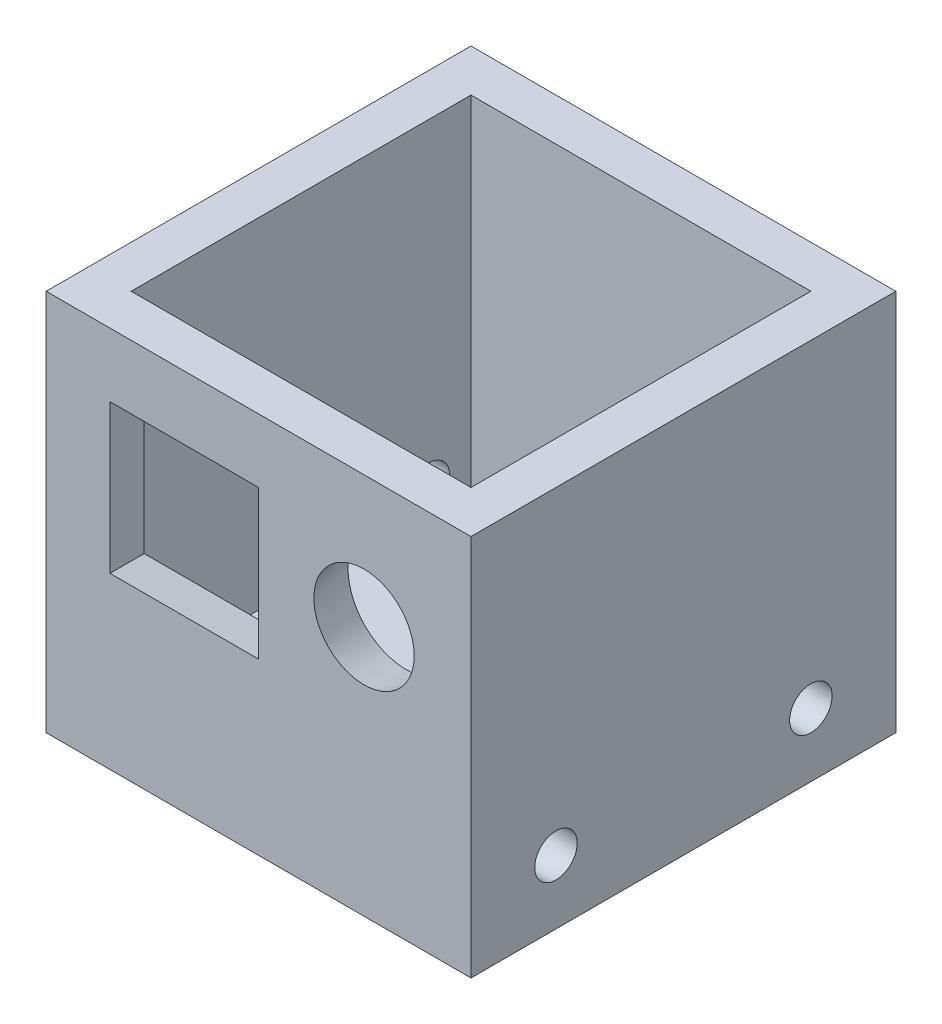
ISO-10303-21;
HEADER;
FILE_DESCRIPTION(('STEP AP214'),'2;1');
FILE_NAME('part.step','',(''),(''),'','','');
FILE_SCHEMA(('AUTOMOTIVE_DESIGN { 1 0 10303 214 1 1 1 1 }'));
ENDSEC;
DATA;
#1=APPLICATION_CONTEXT('core data for automotive mechanical design processes');
#2=APPLICATION_PROTOCOL_DEFINITION('international standard','automotive_design',2000,#1);
#3=PRODUCT_CONTEXT('',#1,'mechanical');
#4=PRODUCT('Part','Part','',(#3));
#5=PRODUCT_RELATED_PRODUCT_CATEGORY('part','',(#4));
#6=PRODUCT_DEFINITION_FORMATION('','',#4);
#7=PRODUCT_DEFINITION_CONTEXT('part definition',#1,'design');
#8=PRODUCT_DEFINITION('design','',#6,#7);
#9=PRODUCT_DEFINITION_SHAPE('','',#8);
#10=(LENGTH_UNIT() NAMED_UNIT(*) SI_UNIT(.MILLI.,.METRE.));
#11=(NAMED_UNIT(*) PLANE_ANGLE_UNIT() SI_UNIT($,.RADIAN.));
#12=(NAMED_UNIT(*) SI_UNIT($,.STERADIAN.) SOLID_ANGLE_UNIT());
#13=UNCERTAINTY_MEASURE_WITH_UNIT(LENGTH_MEASURE(1.E-05),#10,'distance_accuracy_value','');
#14=(GEOMETRIC_REPRESENTATION_CONTEXT(3) GLOBAL_UNCERTAINTY_ASSIGNED_CONTEXT((#13)) GLOBAL_UNIT_ASSIGNED_CONTEXT((#10,
#11,#12)) REPRESENTATION_CONTEXT('',''));
#15=CARTESIAN_POINT('',(0.,0.,0.));
#16=DIRECTION('',(0.,0.,1.));
#17=DIRECTION('',(1.,0.,0.));
#18=AXIS2_PLACEMENT_3D('',#15,#16,#17);
#19=CARTESIAN_POINT('',(0.,9.,0.));
#20=DIRECTION('',(1.,0.,0.));
#21=DIRECTION('',(0.,0.,-1.));
#22=AXIS2_PLACEMENT_3D('',#19,#20,#21);
#23=PLANE('',#22);
#24=CARTESIAN_POINT('',(0.,1.5,-2.));
#25=DIRECTION('',(1.,0.,0.));
#26=DIRECTION('',(0.,0.,-1.));
#27=AXIS2_PLACEMENT_3D('',#24,#25,#26);
#28=CIRCLE('',#27,0.5);
#29=CARTESIAN_POINT('',(0.,1.5,-2.5));
#30=VERTEX_POINT('',#29);
#31=EDGE_CURVE('E333',#30,#30,#28,.T.);
#32=ORIENTED_EDGE('',*,*,#31,.T.);
#33=EDGE_LOOP('',(#32));
#34=FACE_BOUND('',#33,.T.);
#35=CARTESIAN_POINT('',(0.,1.5,-8.));
#36=DIRECTION('',(1.,0.,0.));
#37=DIRECTION('',(0.,0.,-1.));
#38=AXIS2_PLACEMENT_3D('',#35,#36,#37);
#39=CIRCLE('',#38,0.500000000000001);
#40=CARTESIAN_POINT('',(0.,1.5,-8.5));
#41=VERTEX_POINT('',#40);
#42=EDGE_CURVE('E336',#41,#41,#39,.T.);
#43=ORIENTED_EDGE('',*,*,#42,.T.);
#44=EDGE_LOOP('',(#43));
#45=FACE_BOUND('',#44,.T.);
#46=DIRECTION('',(0.,0.,1.));
#47=VECTOR('',#46,1.);
#48=CARTESIAN_POINT('',(0.,0.,0.));
#49=LINE('',#48,#47);
#50=CARTESIAN_POINT('',(0.,0.,-10.));
#51=VERTEX_POINT('',#50);
#52=CARTESIAN_POINT('',(0.,0.,0.));
#53=VERTEX_POINT('',#52);
#54=EDGE_CURVE('E242',#51,#53,#49,.T.);
#55=ORIENTED_EDGE('',*,*,#54,.T.);
#56=DIRECTION('',(0.,-1.,0.));
#57=VECTOR('',#56,1.);
#58=CARTESIAN_POINT('',(0.,9.,0.));
#59=LINE('',#58,#57);
#60=CARTESIAN_POINT('',(0.,9.,0.));
#61=VERTEX_POINT('',#60);
#62=EDGE_CURVE('E49',#61,#53,#59,.T.);
#63=ORIENTED_EDGE('',*,*,#62,.F.);
#64=DIRECTION('',(0.,0.,1.));
#65=VECTOR('',#64,1.);
#66=CARTESIAN_POINT('',(0.,9.,0.));
#67=LINE('',#66,#65);
#68=CARTESIAN_POINT('',(0.,9.,-10.));
#69=VERTEX_POINT('',#68);
#70=EDGE_CURVE('E254',#69,#61,#67,.T.);
#71=ORIENTED_EDGE('',*,*,#70,.F.);
#72=DIRECTION('',(0.,-1.,0.));
#73=VECTOR('',#72,1.);
#74=CARTESIAN_POINT('',(0.,9.,-10.));
#75=LINE('',#74,#73);
#76=EDGE_CURVE('E268',#69,#51,#75,.T.);
#77=ORIENTED_EDGE('',*,*,#76,.T.);
#78=EDGE_LOOP('',(#55,#63,#71,#77));
#79=FACE_BOUND('',#78,.T.);
#80=ADVANCED_FACE('F41',(#34,#45,#79),#23,.F.);
#81=CARTESIAN_POINT('',(0.,9.,0.));
#82=DIRECTION('',(0.,0.,-1.));
#83=DIRECTION('',(-1.,0.,0.));
#84=AXIS2_PLACEMENT_3D('',#81,#82,#83);
#85=PLANE('',#84);
#86=DIRECTION('',(1.,0.,0.));
#87=VECTOR('',#86,1.);
#88=CARTESIAN_POINT('',(1.5,4.,0.));
#89=LINE('',#88,#87);
#90=CARTESIAN_POINT('',(1.5,4.,0.));
#91=VERTEX_POINT('',#90);
#92=CARTESIAN_POINT('',(5.,4.,0.));
#93=VERTEX_POINT('',#92);
#94=EDGE_CURVE('E226',#91,#93,#89,.T.);
#95=ORIENTED_EDGE('',*,*,#94,.F.);
#96=DIRECTION('',(0.,-1.,0.));
#97=VECTOR('',#96,1.);
#98=CARTESIAN_POINT('',(1.5,7.5,0.));
#99=LINE('',#98,#97);
#100=CARTESIAN_POINT('',(1.5,7.5,0.));
#101=VERTEX_POINT('',#100);
#102=EDGE_CURVE('E222',#101,#91,#99,.T.);
#103=ORIENTED_EDGE('',*,*,#102,.F.);
#104=DIRECTION('',(-1.,0.,0.));
#105=VECTOR('',#104,1.);
#106=CARTESIAN_POINT('',(1.5,7.5,0.));
#107=LINE('',#106,#105);
#108=CARTESIAN_POINT('',(5.,7.5,0.));
#109=VERTEX_POINT('',#108);
#110=EDGE_CURVE('E234',#109,#101,#107,.T.);
#111=ORIENTED_EDGE('',*,*,#110,.F.);
#112=DIRECTION('',(0.,1.,0.));
#113=VECTOR('',#112,1.);
#114=CARTESIAN_POINT('',(5.,7.5,0.));
#115=LINE('',#114,#113);
#116=EDGE_CURVE('E230',#93,#109,#115,.T.);
#117=ORIENTED_EDGE('',*,*,#116,.F.);
#118=EDGE_LOOP('',(#95,#103,#111,#117));
#119=FACE_BOUND('',#118,.T.);
#120=CARTESIAN_POINT('',(7.48148315607366,5.89781063459327,0.));
#121=DIRECTION('',(0.,0.,1.));
#122=DIRECTION('',(1.,0.,0.));
#123=AXIS2_PLACEMENT_3D('',#120,#121,#122);
#124=CIRCLE('',#123,1.18058500984475);
#125=CARTESIAN_POINT('',(8.66206816591841,5.89781063459327,0.));
#126=VERTEX_POINT('',#125);
#127=EDGE_CURVE('E221',#126,#126,#124,.T.);
#128=ORIENTED_EDGE('',*,*,#127,.F.);
#129=EDGE_LOOP('',(#128));
#130=FACE_BOUND('',#129,.T.);
#131=DIRECTION('',(1.,0.,0.));
#132=VECTOR('',#131,1.);
#133=CARTESIAN_POINT('',(0.,0.,0.));
#134=LINE('',#133,#132);
#135=CARTESIAN_POINT('',(10.,0.,0.));
#136=VERTEX_POINT('',#135);
#137=EDGE_CURVE('E272',#53,#136,#134,.T.);
#138=ORIENTED_EDGE('',*,*,#137,.T.);
#139=DIRECTION('',(0.,-1.,0.));
#140=VECTOR('',#139,1.);
#141=CARTESIAN_POINT('',(10.,9.,0.));
#142=LINE('',#141,#140);
#143=CARTESIAN_POINT('',(10.,9.,0.));
#144=VERTEX_POINT('',#143);
#145=EDGE_CURVE('E287',#144,#136,#142,.T.);
#146=ORIENTED_EDGE('',*,*,#145,.F.);
#147=DIRECTION('',(1.,0.,0.));
#148=VECTOR('',#147,1.);
#149=CARTESIAN_POINT('',(0.,9.,0.));
#150=LINE('',#149,#148);
#151=EDGE_CURVE('E258',#61,#144,#150,.T.);
#152=ORIENTED_EDGE('',*,*,#151,.F.);
#153=ORIENTED_EDGE('',*,*,#62,.T.);
#154=EDGE_LOOP('',(#138,#146,#152,#153));
#155=FACE_BOUND('',#154,.T.);
#156=ADVANCED_FACE('F294',(#119,#130,#155),#85,.F.);
#157=CARTESIAN_POINT('',(10.,9.,0.));
#158=DIRECTION('',(-1.,0.,0.));
#159=DIRECTION('',(0.,0.,1.));
#160=AXIS2_PLACEMENT_3D('',#157,#158,#159);
#161=PLANE('',#160);
#162=CARTESIAN_POINT('',(10.,1.5,-2.));
#163=DIRECTION('',(1.,0.,0.));
#164=DIRECTION('',(0.,0.,-1.));
#165=AXIS2_PLACEMENT_3D('',#162,#163,#164);
#166=CIRCLE('',#165,0.5);
#167=CARTESIAN_POINT('',(10.,1.5,-2.5));
#168=VERTEX_POINT('',#167);
#169=EDGE_CURVE('E339',#168,#168,#166,.T.);
#170=ORIENTED_EDGE('',*,*,#169,.F.);
#171=EDGE_LOOP('',(#170));
#172=FACE_BOUND('',#171,.T.);
#173=CARTESIAN_POINT('',(10.,1.5,-8.));
#174=DIRECTION('',(1.,0.,0.));
#175=DIRECTION('',(0.,0.,-1.));
#176=AXIS2_PLACEMENT_3D('',#173,#174,#175);
#177=CIRCLE('',#176,0.500000000000001);
#178=CARTESIAN_POINT('',(10.,1.5,-8.5));
#179=VERTEX_POINT('',#178);
#180=EDGE_CURVE('E340',#179,#179,#177,.T.);
#181=ORIENTED_EDGE('',*,*,#180,.F.);
#182=EDGE_LOOP('',(#181));
#183=FACE_BOUND('',#182,.T.);
#184=DIRECTION('',(0.,0.,-1.));
#185=VECTOR('',#184,1.);
#186=CARTESIAN_POINT('',(10.,0.,0.));
#187=LINE('',#186,#185);
#188=CARTESIAN_POINT('',(10.,0.,-10.));
#189=VERTEX_POINT('',#188);
#190=EDGE_CURVE('E275',#136,#189,#187,.T.);
#191=ORIENTED_EDGE('',*,*,#190,.T.);
#192=DIRECTION('',(0.,-1.,0.));
#193=VECTOR('',#192,1.);
#194=CARTESIAN_POINT('',(10.,9.,-10.));
#195=LINE('',#194,#193);
#196=CARTESIAN_POINT('',(10.,9.,-10.));
#197=VERTEX_POINT('',#196);
#198=EDGE_CURVE('E283',#197,#189,#195,.T.);
#199=ORIENTED_EDGE('',*,*,#198,.F.);
#200=DIRECTION('',(0.,0.,-1.));
#201=VECTOR('',#200,1.);
#202=CARTESIAN_POINT('',(10.,9.,0.));
#203=LINE('',#202,#201);
#204=EDGE_CURVE('E262',#144,#197,#203,.T.);
#205=ORIENTED_EDGE('',*,*,#204,.F.);
#206=ORIENTED_EDGE('',*,*,#145,.T.);
#207=EDGE_LOOP('',(#191,#199,#205,#206));
#208=FACE_BOUND('',#207,.T.);
#209=ADVANCED_FACE('F306',(#172,#183,#208),#161,.F.);
#210=CARTESIAN_POINT('',(0.,9.,-10.));
#211=DIRECTION('',(0.,0.,1.));
#212=DIRECTION('',(1.,0.,0.));
#213=AXIS2_PLACEMENT_3D('',#210,#211,#212);
#214=PLANE('',#213);
#215=DIRECTION('',(-1.,0.,0.));
#216=VECTOR('',#215,1.);
#217=CARTESIAN_POINT('',(0.,0.,-10.));
#218=LINE('',#217,#216);
#219=EDGE_CURVE('E259',#189,#51,#218,.T.);
#220=ORIENTED_EDGE('',*,*,#219,.T.);
#221=ORIENTED_EDGE('',*,*,#76,.F.);
#222=DIRECTION('',(-1.,0.,0.));
#223=VECTOR('',#222,1.);
#224=CARTESIAN_POINT('',(0.,9.,-10.));
#225=LINE('',#224,#223);
#226=EDGE_CURVE('E265',#197,#69,#225,.T.);
#227=ORIENTED_EDGE('',*,*,#226,.F.);
#228=ORIENTED_EDGE('',*,*,#198,.T.);
#229=EDGE_LOOP('',(#220,#221,#227,#228));
#230=FACE_BOUND('',#229,.T.);
#231=ADVANCED_FACE('F310',(#230),#214,.F.);
#232=CARTESIAN_POINT('',(0.,9.,0.));
#233=DIRECTION('',(0.,-1.,0.));
#234=DIRECTION('',(0.,0.,-1.));
#235=AXIS2_PLACEMENT_3D('',#232,#233,#234);
#236=PLANE('',#235);
#237=DIRECTION('',(-1.,0.,0.));
#238=VECTOR('',#237,1.);
#239=CARTESIAN_POINT('',(9.,9.,-9.));
#240=LINE('',#239,#238);
#241=CARTESIAN_POINT('',(9.,9.,-9.));
#242=VERTEX_POINT('',#241);
#243=CARTESIAN_POINT('',(1.,9.,-9.));
#244=VERTEX_POINT('',#243);
#245=EDGE_CURVE('E186',#242,#244,#240,.T.);
#246=ORIENTED_EDGE('',*,*,#245,.F.);
#247=DIRECTION('',(0.,0.,-1.));
#248=VECTOR('',#247,1.);
#249=CARTESIAN_POINT('',(9.,9.,-9.));
#250=LINE('',#249,#248);
#251=CARTESIAN_POINT('',(9.,9.,-1.));
#252=VERTEX_POINT('',#251);
#253=EDGE_CURVE('E160',#252,#242,#250,.T.);
#254=ORIENTED_EDGE('',*,*,#253,.F.);
#255=DIRECTION('',(1.,0.,0.));
#256=VECTOR('',#255,1.);
#257=CARTESIAN_POINT('',(9.,9.,-1.));
#258=LINE('',#257,#256);
#259=CARTESIAN_POINT('',(1.,9.,-0.999999999999999));
#260=VERTEX_POINT('',#259);
#261=EDGE_CURVE('E153',#260,#252,#258,.T.);
#262=ORIENTED_EDGE('',*,*,#261,.F.);
#263=DIRECTION('',(0.,0.,1.));
#264=VECTOR('',#263,1.);
#265=CARTESIAN_POINT('',(1.,9.,-9.));
#266=LINE('',#265,#264);
#267=EDGE_CURVE('E190',#244,#260,#266,.T.);
#268=ORIENTED_EDGE('',*,*,#267,.F.);
#269=EDGE_LOOP('',(#246,#254,#262,#268));
#270=FACE_BOUND('',#269,.T.);
#271=ORIENTED_EDGE('',*,*,#70,.T.);
#272=ORIENTED_EDGE('',*,*,#151,.T.);
#273=ORIENTED_EDGE('',*,*,#204,.T.);
#274=ORIENTED_EDGE('',*,*,#226,.T.);
#275=EDGE_LOOP('',(#271,#272,#273,#274));
#276=FACE_BOUND('',#275,.T.);
#277=ADVANCED_FACE('F312',(#270,#276),#236,.F.);
#278=CARTESIAN_POINT('',(0.,0.,0.));
#279=DIRECTION('',(0.,-1.,0.));
#280=DIRECTION('',(0.,0.,-1.));
#281=AXIS2_PLACEMENT_3D('',#278,#279,#280);
#282=PLANE('',#281);
#283=ORIENTED_EDGE('',*,*,#54,.F.);
#284=ORIENTED_EDGE('',*,*,#219,.F.);
#285=ORIENTED_EDGE('',*,*,#190,.F.);
#286=ORIENTED_EDGE('',*,*,#137,.F.);
#287=EDGE_LOOP('',(#283,#284,#285,#286));
#288=FACE_BOUND('',#287,.T.);
#289=ADVANCED_FACE('F302',(#288),#282,.T.);
#290=CARTESIAN_POINT('',(7.48148315607366,5.89781063459327,0.));
#291=DIRECTION('',(0.,0.,-1.));
#292=DIRECTION('',(1.,0.,0.));
#293=AXIS2_PLACEMENT_3D('',#290,#291,#292);
#294=CONICAL_SURFACE('',#293,1.18058500984475,0.191986217719376);
#295=CARTESIAN_POINT('',(7.48148315607366,5.89781063459327,-1.));
#296=DIRECTION('',(0.,0.,1.));
#297=DIRECTION('',(1.,0.,0.));
#298=AXIS2_PLACEMENT_3D('',#295,#296,#297);
#299=CIRCLE('',#298,1.37496531898247);
#300=CARTESIAN_POINT('',(8.85644847505613,5.89781063459327,-1.));
#301=VERTEX_POINT('',#300);
#302=EDGE_CURVE('E217',#301,#301,#299,.F.);
#303=ORIENTED_EDGE('',*,*,#302,.T.);
#304=EDGE_LOOP('',(#303));
#305=FACE_BOUND('',#304,.T.);
#306=ORIENTED_EDGE('',*,*,#127,.T.);
#307=EDGE_LOOP('',(#306));
#308=FACE_BOUND('',#307,.T.);
#309=ADVANCED_FACE('F320',(#305,#308),#294,.F.);
#310=CARTESIAN_POINT('',(1.5,7.5,0.));
#311=DIRECTION('',(-0.981627183447664,0.,0.190808995376545));
#312=DIRECTION('',(0.190808995376545,0.,0.981627183447664));
#313=AXIS2_PLACEMENT_3D('',#310,#311,#312);
#314=PLANE('',#313);
#315=DIRECTION('',(0.187427559991896,0.187427559991896,0.964231206459824));
#316=VECTOR('',#315,1.);
#317=CARTESIAN_POINT('',(1.62295181585581,4.1229518158558,0.632532258031824));
#318=LINE('',#317,#316);
#319=CARTESIAN_POINT('',(1.30561969086228,3.80561969086228,-0.999999999999999));
#320=VERTEX_POINT('',#319);
#321=EDGE_CURVE('E238',#320,#91,#318,.T.);
#322=ORIENTED_EDGE('',*,*,#321,.F.);
#323=DIRECTION('',(0.,1.,0.));
#324=VECTOR('',#323,1.);
#325=CARTESIAN_POINT('',(1.30561969086228,7.5,-0.999999999999999));
#326=LINE('',#325,#324);
#327=CARTESIAN_POINT('',(1.30561969086228,7.69438030913772,-0.999999999999999));
#328=VERTEX_POINT('',#327);
#329=EDGE_CURVE('E213',#320,#328,#326,.T.);
#330=ORIENTED_EDGE('',*,*,#329,.T.);
#331=DIRECTION('',(0.187427559991896,-0.187427559991896,0.964231206459824));
#332=VECTOR('',#331,1.);
#333=CARTESIAN_POINT('',(1.5,7.5,0.));
#334=LINE('',#333,#332);
#335=EDGE_CURVE('E239',#328,#101,#334,.T.);
#336=ORIENTED_EDGE('',*,*,#335,.T.);
#337=ORIENTED_EDGE('',*,*,#102,.T.);
#338=EDGE_LOOP('',(#322,#330,#336,#337));
#339=FACE_BOUND('',#338,.T.);
#340=ADVANCED_FACE('F396',(#339),#314,.F.);
#341=CARTESIAN_POINT('',(1.5,7.5,0.));
#342=DIRECTION('',(0.,0.981627183447664,0.190808995376545));
#343=DIRECTION('',(0.,-0.190808995376545,0.981627183447664));
#344=AXIS2_PLACEMENT_3D('',#341,#342,#343);
#345=PLANE('',#344);
#346=ORIENTED_EDGE('',*,*,#335,.F.);
#347=DIRECTION('',(1.,0.,0.));
#348=VECTOR('',#347,1.);
#349=CARTESIAN_POINT('',(1.5,7.69438030913772,-0.999999999999999));
#350=LINE('',#349,#348);
#351=CARTESIAN_POINT('',(5.19438030913772,7.69438030913772,-1.));
#352=VERTEX_POINT('',#351);
#353=EDGE_CURVE('E209',#328,#352,#350,.T.);
#354=ORIENTED_EDGE('',*,*,#353,.T.);
#355=DIRECTION('',(-0.187427559991896,-0.187427559991896,0.964231206459824));
#356=VECTOR('',#355,1.);
#357=CARTESIAN_POINT('',(5.,7.5,0.));
#358=LINE('',#357,#356);
#359=EDGE_CURVE('E243',#352,#109,#358,.T.);
#360=ORIENTED_EDGE('',*,*,#359,.T.);
#361=ORIENTED_EDGE('',*,*,#110,.T.);
#362=EDGE_LOOP('',(#346,#354,#360,#361));
#363=FACE_BOUND('',#362,.T.);
#364=ADVANCED_FACE('F399',(#363),#345,.F.);
#365=CARTESIAN_POINT('',(5.,7.5,0.));
#366=DIRECTION('',(0.981627183447664,0.,0.190808995376545));
#367=DIRECTION('',(0.190808995376545,0.,-0.981627183447664));
#368=AXIS2_PLACEMENT_3D('',#365,#366,#367);
#369=PLANE('',#368);
#370=ORIENTED_EDGE('',*,*,#359,.F.);
#371=DIRECTION('',(0.,-1.,0.));
#372=VECTOR('',#371,1.);
#373=CARTESIAN_POINT('',(5.19438030913772,7.5,-0.999999999999999));
#374=LINE('',#373,#372);
#375=CARTESIAN_POINT('',(5.19438030913772,3.80561969086228,-0.999999999999999));
#376=VERTEX_POINT('',#375);
#377=EDGE_CURVE('E200',#352,#376,#374,.T.);
#378=ORIENTED_EDGE('',*,*,#377,.T.);
#379=DIRECTION('',(-0.187427559991896,0.187427559991896,0.964231206459824));
#380=VECTOR('',#379,1.);
#381=CARTESIAN_POINT('',(4.8770481841442,4.12295181585581,0.632532258031825));
#382=LINE('',#381,#380);
#383=EDGE_CURVE('E246',#376,#93,#382,.T.);
#384=ORIENTED_EDGE('',*,*,#383,.T.);
#385=ORIENTED_EDGE('',*,*,#116,.T.);
#386=EDGE_LOOP('',(#370,#378,#384,#385));
#387=FACE_BOUND('',#386,.T.);
#388=ADVANCED_FACE('F403',(#387),#369,.F.);
#389=CARTESIAN_POINT('',(1.5,4.,0.));
#390=DIRECTION('',(0.,-0.981627183447664,0.190808995376545));
#391=DIRECTION('',(0.,-0.190808995376545,-0.981627183447664));
#392=AXIS2_PLACEMENT_3D('',#389,#390,#391);
#393=PLANE('',#392);
#394=ORIENTED_EDGE('',*,*,#383,.F.);
#395=DIRECTION('',(-1.,0.,0.));
#396=VECTOR('',#395,1.);
#397=CARTESIAN_POINT('',(1.5,3.80561969086228,-0.999999999999999));
#398=LINE('',#397,#396);
#399=EDGE_CURVE('E11',#376,#320,#398,.T.);
#400=ORIENTED_EDGE('',*,*,#399,.T.);
#401=ORIENTED_EDGE('',*,*,#321,.T.);
#402=ORIENTED_EDGE('',*,*,#94,.T.);
#403=EDGE_LOOP('',(#394,#400,#401,#402));
#404=FACE_BOUND('',#403,.T.);
#405=ADVANCED_FACE('F386',(#404),#393,.F.);
#406=CARTESIAN_POINT('',(9.,0.999999999999999,-1.));
#407=DIRECTION('',(0.,0.,1.));
#408=DIRECTION('',(1.,0.,0.));
#409=AXIS2_PLACEMENT_3D('',#406,#407,#408);
#410=PLANE('',#409);
#411=ORIENTED_EDGE('',*,*,#399,.F.);
#412=ORIENTED_EDGE('',*,*,#377,.F.);
#413=ORIENTED_EDGE('',*,*,#353,.F.);
#414=ORIENTED_EDGE('',*,*,#329,.F.);
#415=EDGE_LOOP('',(#411,#412,#413,#414));
#416=FACE_BOUND('',#415,.T.);
#417=ORIENTED_EDGE('',*,*,#261,.T.);
#418=DIRECTION('',(0.,1.,0.));
#419=VECTOR('',#418,1.);
#420=CARTESIAN_POINT('',(9.,0.999999999999999,-1.));
#421=LINE('',#420,#419);
#422=CARTESIAN_POINT('',(9.,0.999999999999999,-1.));
#423=VERTEX_POINT('',#422);
#424=EDGE_CURVE('E197',#423,#252,#421,.T.);
#425=ORIENTED_EDGE('',*,*,#424,.F.);
#426=DIRECTION('',(1.,0.,0.));
#427=VECTOR('',#426,1.);
#428=CARTESIAN_POINT('',(9.,0.999999999999999,-1.));
#429=LINE('',#428,#427);
#430=CARTESIAN_POINT('',(1.,0.999999999999999,-0.999999999999999));
#431=VERTEX_POINT('',#430);
#432=EDGE_CURVE('E166',#431,#423,#429,.T.);
#433=ORIENTED_EDGE('',*,*,#432,.F.);
#434=DIRECTION('',(0.,1.,0.));
#435=VECTOR('',#434,1.);
#436=CARTESIAN_POINT('',(1.,0.999999999999999,-0.999999999999999));
#437=LINE('',#436,#435);
#438=EDGE_CURVE('E201',#431,#260,#437,.T.);
#439=ORIENTED_EDGE('',*,*,#438,.T.);
#440=EDGE_LOOP('',(#417,#425,#433,#439));
#441=FACE_BOUND('',#440,.T.);
#442=ORIENTED_EDGE('',*,*,#302,.F.);
#443=EDGE_LOOP('',(#442));
#444=FACE_BOUND('',#443,.T.);
#445=ADVANCED_FACE('F383',(#416,#441,#444),#410,.F.);
#446=CARTESIAN_POINT('',(9.,0.999999999999999,-9.));
#447=DIRECTION('',(1.,0.,0.));
#448=DIRECTION('',(0.,0.,-1.));
#449=AXIS2_PLACEMENT_3D('',#446,#447,#448);
#450=PLANE('',#449);
#451=DIRECTION('',(0.,0.,-1.));
#452=VECTOR('',#451,1.);
#453=CARTESIAN_POINT('',(9.,0.999999999999999,-9.));
#454=LINE('',#453,#452);
#455=CARTESIAN_POINT('',(9.,0.999999999999999,-2.));
#456=VERTEX_POINT('',#455);
#457=CARTESIAN_POINT('',(9.,0.999999999999999,-8.));
#458=VERTEX_POINT('',#457);
#459=EDGE_CURVE('E149',#456,#458,#454,.T.);
#460=ORIENTED_EDGE('',*,*,#459,.F.);
#461=CARTESIAN_POINT('',(9.,1.5,-2.));
#462=DIRECTION('',(1.,0.,0.));
#463=DIRECTION('',(0.,0.,-1.));
#464=AXIS2_PLACEMENT_3D('',#461,#462,#463);
#465=CIRCLE('',#464,0.5);
#466=EDGE_CURVE('E187',#456,#456,#465,.T.);
#467=ORIENTED_EDGE('',*,*,#466,.T.);
#468=EDGE_CURVE('E155',#423,#456,#454,.T.);
#469=ORIENTED_EDGE('',*,*,#468,.F.);
#470=ORIENTED_EDGE('',*,*,#424,.T.);
#471=ORIENTED_EDGE('',*,*,#253,.T.);
#472=DIRECTION('',(0.,1.,0.));
#473=VECTOR('',#472,1.);
#474=CARTESIAN_POINT('',(9.,0.999999999999999,-9.));
#475=LINE('',#474,#473);
#476=CARTESIAN_POINT('',(9.,0.999999999999999,-9.));
#477=VERTEX_POINT('',#476);
#478=EDGE_CURVE('E157',#477,#242,#475,.T.);
#479=ORIENTED_EDGE('',*,*,#478,.F.);
#480=EDGE_CURVE('E141',#458,#477,#454,.T.);
#481=ORIENTED_EDGE('',*,*,#480,.F.);
#482=CARTESIAN_POINT('',(9.,1.5,-8.));
#483=DIRECTION('',(1.,0.,0.));
#484=DIRECTION('',(0.,0.,-1.));
#485=AXIS2_PLACEMENT_3D('',#482,#483,#484);
#486=CIRCLE('',#485,0.500000000000001);
#487=EDGE_CURVE('E352',#458,#458,#486,.T.);
#488=ORIENTED_EDGE('',*,*,#487,.T.);
#489=EDGE_LOOP('',(#460,#467,#469,#470,#471,#479,#481,#488));
#490=FACE_BOUND('',#489,.T.);
#491=ADVANCED_FACE('F158',(#490),#450,.F.);
#492=CARTESIAN_POINT('',(1.,0.999999999999999,-9.));
#493=DIRECTION('',(-1.,0.,0.));
#494=DIRECTION('',(0.,0.,1.));
#495=AXIS2_PLACEMENT_3D('',#492,#493,#494);
#496=PLANE('',#495);
#497=DIRECTION('',(0.,0.,1.));
#498=VECTOR('',#497,1.);
#499=CARTESIAN_POINT('',(1.,0.999999999999999,-9.));
#500=LINE('',#499,#498);
#501=CARTESIAN_POINT('',(1.,0.999999999999999,-2.));
#502=VERTEX_POINT('',#501);
#503=EDGE_CURVE('E171',#502,#431,#500,.T.);
#504=ORIENTED_EDGE('',*,*,#503,.F.);
#505=CARTESIAN_POINT('',(1.,1.5,-2.));
#506=DIRECTION('',(-1.,0.,0.));
#507=DIRECTION('',(0.,0.,1.));
#508=AXIS2_PLACEMENT_3D('',#505,#506,#507);
#509=CIRCLE('',#508,0.5);
#510=EDGE_CURVE('E54',#502,#502,#509,.T.);
#511=ORIENTED_EDGE('',*,*,#510,.T.);
#512=CARTESIAN_POINT('',(1.,0.999999999999999,-8.));
#513=VERTEX_POINT('',#512);
#514=EDGE_CURVE('E175',#513,#502,#500,.T.);
#515=ORIENTED_EDGE('',*,*,#514,.F.);
#516=CARTESIAN_POINT('',(1.,1.5,-8.));
#517=DIRECTION('',(-1.,0.,0.));
#518=DIRECTION('',(0.,0.,1.));
#519=AXIS2_PLACEMENT_3D('',#516,#517,#518);
#520=CIRCLE('',#519,0.500000000000001);
#521=EDGE_CURVE('E59',#513,#513,#520,.T.);
#522=ORIENTED_EDGE('',*,*,#521,.T.);
#523=CARTESIAN_POINT('',(1.,0.999999999999999,-9.));
#524=VERTEX_POINT('',#523);
#525=EDGE_CURVE('E177',#524,#513,#500,.T.);
#526=ORIENTED_EDGE('',*,*,#525,.F.);
#527=DIRECTION('',(0.,1.,0.));
#528=VECTOR('',#527,1.);
#529=CARTESIAN_POINT('',(1.,0.999999999999999,-9.));
#530=LINE('',#529,#528);
#531=EDGE_CURVE('E165',#524,#244,#530,.T.);
#532=ORIENTED_EDGE('',*,*,#531,.T.);
#533=ORIENTED_EDGE('',*,*,#267,.T.);
#534=ORIENTED_EDGE('',*,*,#438,.F.);
#535=EDGE_LOOP('',(#504,#511,#515,#522,#526,#532,#533,#534));
#536=FACE_BOUND('',#535,.T.);
#537=ADVANCED_FACE('F388',(#536),#496,.F.);
#538=CARTESIAN_POINT('',(9.,0.999999999999999,-9.));
#539=DIRECTION('',(0.,0.,-1.));
#540=DIRECTION('',(-1.,0.,0.));
#541=AXIS2_PLACEMENT_3D('',#538,#539,#540);
#542=PLANE('',#541);
#543=ORIENTED_EDGE('',*,*,#245,.T.);
#544=ORIENTED_EDGE('',*,*,#531,.F.);
#545=DIRECTION('',(-1.,0.,0.));
#546=VECTOR('',#545,1.);
#547=CARTESIAN_POINT('',(9.,0.999999999999999,-9.));
#548=LINE('',#547,#546);
#549=EDGE_CURVE('E146',#477,#524,#548,.T.);
#550=ORIENTED_EDGE('',*,*,#549,.F.);
#551=ORIENTED_EDGE('',*,*,#478,.T.);
#552=EDGE_LOOP('',(#543,#544,#550,#551));
#553=FACE_BOUND('',#552,.T.);
#554=ADVANCED_FACE('F168',(#553),#542,.F.);
#555=CARTESIAN_POINT('',(0.,0.999999999999999,0.));
#556=DIRECTION('',(0.,-1.,0.));
#557=DIRECTION('',(0.,0.,-1.));
#558=AXIS2_PLACEMENT_3D('',#555,#556,#557);
#559=PLANE('',#558);
#560=ORIENTED_EDGE('',*,*,#525,.T.);
#561=ORIENTED_EDGE('',*,*,#514,.T.);
#562=ORIENTED_EDGE('',*,*,#503,.T.);
#563=ORIENTED_EDGE('',*,*,#432,.T.);
#564=ORIENTED_EDGE('',*,*,#468,.T.);
#565=ORIENTED_EDGE('',*,*,#459,.T.);
#566=ORIENTED_EDGE('',*,*,#480,.T.);
#567=ORIENTED_EDGE('',*,*,#549,.T.);
#568=EDGE_LOOP('',(#560,#561,#562,#563,#564,#565,#566,#567));
#569=FACE_BOUND('',#568,.T.);
#570=ADVANCED_FACE('F144',(#569),#559,.F.);
#571=CARTESIAN_POINT('',(0.,1.5,-8.));
#572=DIRECTION('',(1.,0.,0.));
#573=DIRECTION('',(0.,0.,-1.));
#574=AXIS2_PLACEMENT_3D('',#571,#572,#573);
#575=CYLINDRICAL_SURFACE('',#574,0.500000000000001);
#576=ORIENTED_EDGE('',*,*,#42,.F.);
#577=EDGE_LOOP('',(#576));
#578=FACE_BOUND('',#577,.T.);
#579=ORIENTED_EDGE('',*,*,#521,.F.);
#580=EDGE_LOOP('',(#579));
#581=FACE_BOUND('',#580,.T.);
#582=ADVANCED_FACE('F371',(#578,#581),#575,.F.);
#583=CARTESIAN_POINT('',(0.,1.5,-2.));
#584=DIRECTION('',(1.,0.,0.));
#585=DIRECTION('',(0.,0.,-1.));
#586=AXIS2_PLACEMENT_3D('',#583,#584,#585);
#587=CYLINDRICAL_SURFACE('',#586,0.5);
#588=ORIENTED_EDGE('',*,*,#31,.F.);
#589=EDGE_LOOP('',(#588));
#590=FACE_BOUND('',#589,.T.);
#591=ORIENTED_EDGE('',*,*,#510,.F.);
#592=EDGE_LOOP('',(#591));
#593=FACE_BOUND('',#592,.T.);
#594=ADVANCED_FACE('F365',(#590,#593),#587,.F.);
#595=ORIENTED_EDGE('',*,*,#180,.T.);
#596=EDGE_LOOP('',(#595));
#597=FACE_BOUND('',#596,.T.);
#598=ORIENTED_EDGE('',*,*,#487,.F.);
#599=EDGE_LOOP('',(#598));
#600=FACE_BOUND('',#599,.T.);
#601=ADVANCED_FACE('F362',(#597,#600),#575,.F.);
#602=ORIENTED_EDGE('',*,*,#169,.T.);
#603=EDGE_LOOP('',(#602));
#604=FACE_BOUND('',#603,.T.);
#605=ORIENTED_EDGE('',*,*,#466,.F.);
#606=EDGE_LOOP('',(#605));
#607=FACE_BOUND('',#606,.T.);
#608=ADVANCED_FACE('F360',(#604,#607),#587,.F.);
#609=CLOSED_SHELL('',(#80,#156,#209,#231,#277,#289,#309,#340,#364,#388,#405,#445,#491,#537,#554,
#570,#582,#594,#601,#608));
#610=MANIFOLD_SOLID_BREP('B2',#609);
#611=ADVANCED_BREP_SHAPE_REPRESENTATION('',(#18,#610),#14);
#612=SHAPE_DEFINITION_REPRESENTATION(#9,#611);
ENDSEC;
END-ISO-10303-21;
